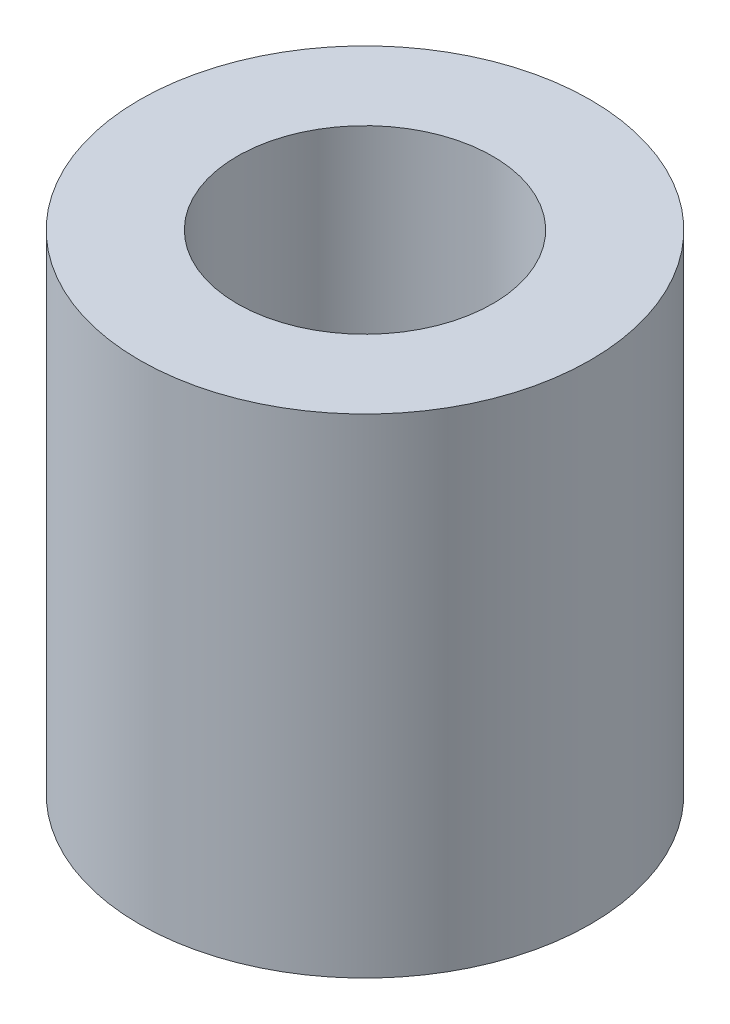
ISO-10303-21;
HEADER;
FILE_DESCRIPTION(('STEP AP214'),'2;1');
FILE_NAME('part.step','',(''),(''),'','','');
FILE_SCHEMA(('AUTOMOTIVE_DESIGN { 1 0 10303 214 1 1 1 1 }'));
ENDSEC;
DATA;
#1=APPLICATION_CONTEXT('core data for automotive mechanical design processes');
#2=APPLICATION_PROTOCOL_DEFINITION('international standard','automotive_design',2000,#1);
#3=PRODUCT_CONTEXT('',#1,'mechanical');
#4=PRODUCT('Part','Part','',(#3));
#5=PRODUCT_RELATED_PRODUCT_CATEGORY('part','',(#4));
#6=PRODUCT_DEFINITION_FORMATION('','',#4);
#7=PRODUCT_DEFINITION_CONTEXT('part definition',#1,'design');
#8=PRODUCT_DEFINITION('design','',#6,#7);
#9=PRODUCT_DEFINITION_SHAPE('','',#8);
#10=(LENGTH_UNIT() NAMED_UNIT(*) SI_UNIT(.MILLI.,.METRE.));
#11=(NAMED_UNIT(*) PLANE_ANGLE_UNIT() SI_UNIT($,.RADIAN.));
#12=(NAMED_UNIT(*) SI_UNIT($,.STERADIAN.) SOLID_ANGLE_UNIT());
#13=UNCERTAINTY_MEASURE_WITH_UNIT(LENGTH_MEASURE(1.E-05),#10,'distance_accuracy_value','');
#14=(GEOMETRIC_REPRESENTATION_CONTEXT(3) GLOBAL_UNCERTAINTY_ASSIGNED_CONTEXT((#13)) GLOBAL_UNIT_ASSIGNED_CONTEXT((#10,
#11,#12)) REPRESENTATION_CONTEXT('',''));
#15=CARTESIAN_POINT('',(0.,0.,0.));
#16=DIRECTION('',(0.,0.,1.));
#17=DIRECTION('',(1.,0.,0.));
#18=AXIS2_PLACEMENT_3D('',#15,#16,#17);
#19=CARTESIAN_POINT('',(0.,3.25,0.));
#20=DIRECTION('',(0.,-1.,0.));
#21=DIRECTION('',(0.,0.,-1.));
#22=AXIS2_PLACEMENT_3D('',#19,#20,#21);
#23=CYLINDRICAL_SURFACE('',#22,3.);
#24=CARTESIAN_POINT('',(0.,3.25,0.));
#25=DIRECTION('',(0.,1.,0.));
#26=DIRECTION('',(0.,0.,1.));
#27=AXIS2_PLACEMENT_3D('',#24,#25,#26);
#28=CIRCLE('',#27,3.);
#29=CARTESIAN_POINT('',(0.,3.25,-3.));
#30=VERTEX_POINT('',#29);
#31=EDGE_CURVE('E10',#30,#30,#28,.T.);
#32=CARTESIAN_POINT('',(0.,-3.25,0.));
#33=DIRECTION('',(0.,1.,0.));
#34=DIRECTION('',(0.,0.,1.));
#35=AXIS2_PLACEMENT_3D('',#32,#33,#34);
#36=CIRCLE('',#35,3.);
#37=CARTESIAN_POINT('',(0.,-3.25,-3.));
#38=VERTEX_POINT('',#37);
#39=EDGE_CURVE('E36',#38,#38,#36,.T.);
#40=CARTESIAN_POINT('',(0.,3.25,-3.));
#41=CARTESIAN_POINT('',(0.,3.18229166666667,-3.));
#42=CARTESIAN_POINT('',(0.,3.11458333333333,-3.));
#43=CARTESIAN_POINT('',(0.,2.97916666666667,-3.));
#44=CARTESIAN_POINT('',(0.,2.91145833333333,-3.));
#45=CARTESIAN_POINT('',(0.,2.77604166666667,-3.));
#46=CARTESIAN_POINT('',(0.,2.70833333333333,-3.));
#47=CARTESIAN_POINT('',(0.,2.57291666666667,-3.));
#48=CARTESIAN_POINT('',(0.,2.50520833333333,-3.));
#49=CARTESIAN_POINT('',(0.,2.36979166666667,-3.));
#50=CARTESIAN_POINT('',(0.,2.30208333333333,-3.));
#51=CARTESIAN_POINT('',(0.,2.16666666666667,-3.));
#52=CARTESIAN_POINT('',(0.,2.09895833333333,-3.));
#53=CARTESIAN_POINT('',(0.,1.96354166666667,-3.));
#54=CARTESIAN_POINT('',(0.,1.89583333333333,-3.));
#55=CARTESIAN_POINT('',(0.,1.76041666666667,-3.));
#56=CARTESIAN_POINT('',(0.,1.69270833333333,-3.));
#57=CARTESIAN_POINT('',(0.,1.55729166666667,-3.));
#58=CARTESIAN_POINT('',(0.,1.48958333333333,-3.));
#59=CARTESIAN_POINT('',(0.,1.35416666666667,-3.));
#60=CARTESIAN_POINT('',(0.,1.28645833333333,-3.));
#61=CARTESIAN_POINT('',(0.,1.15104166666667,-3.));
#62=CARTESIAN_POINT('',(0.,1.08333333333333,-3.));
#63=CARTESIAN_POINT('',(0.,0.947916666666666,-3.));
#64=CARTESIAN_POINT('',(0.,0.880208333333333,-3.));
#65=CARTESIAN_POINT('',(0.,0.744791666666666,-3.));
#66=CARTESIAN_POINT('',(0.,0.677083333333333,-3.));
#67=CARTESIAN_POINT('',(0.,0.541666666666666,-3.));
#68=CARTESIAN_POINT('',(0.,0.473958333333333,-3.));
#69=CARTESIAN_POINT('',(0.,0.338541666666666,-3.));
#70=CARTESIAN_POINT('',(0.,0.270833333333333,-3.));
#71=CARTESIAN_POINT('',(0.,0.135416666666666,-3.));
#72=CARTESIAN_POINT('',(0.,0.0677083333333329,-3.));
#73=CARTESIAN_POINT('',(0.,-0.0677083333333338,-3.));
#74=CARTESIAN_POINT('',(0.,-0.135416666666667,-3.));
#75=CARTESIAN_POINT('',(0.,-0.270833333333334,-3.));
#76=CARTESIAN_POINT('',(0.,-0.338541666666667,-3.));
#77=CARTESIAN_POINT('',(0.,-0.473958333333334,-3.));
#78=CARTESIAN_POINT('',(0.,-0.541666666666667,-3.));
#79=CARTESIAN_POINT('',(0.,-0.677083333333333,-3.));
#80=CARTESIAN_POINT('',(0.,-0.744791666666667,-3.));
#81=CARTESIAN_POINT('',(0.,-0.880208333333333,-3.));
#82=CARTESIAN_POINT('',(0.,-0.947916666666666,-3.));
#83=CARTESIAN_POINT('',(0.,-1.08333333333333,-3.));
#84=CARTESIAN_POINT('',(0.,-1.15104166666667,-3.));
#85=CARTESIAN_POINT('',(0.,-1.28645833333333,-3.));
#86=CARTESIAN_POINT('',(0.,-1.35416666666667,-3.));
#87=CARTESIAN_POINT('',(0.,-1.48958333333333,-3.));
#88=CARTESIAN_POINT('',(0.,-1.55729166666667,-3.));
#89=CARTESIAN_POINT('',(0.,-1.69270833333333,-3.));
#90=CARTESIAN_POINT('',(0.,-1.76041666666667,-3.));
#91=CARTESIAN_POINT('',(0.,-1.89583333333333,-3.));
#92=CARTESIAN_POINT('',(0.,-1.96354166666667,-3.));
#93=CARTESIAN_POINT('',(0.,-2.09895833333333,-3.));
#94=CARTESIAN_POINT('',(0.,-2.16666666666667,-3.));
#95=CARTESIAN_POINT('',(0.,-2.30208333333333,-3.));
#96=CARTESIAN_POINT('',(0.,-2.36979166666667,-3.));
#97=CARTESIAN_POINT('',(0.,-2.50520833333333,-3.));
#98=CARTESIAN_POINT('',(0.,-2.57291666666667,-3.));
#99=CARTESIAN_POINT('',(0.,-2.70833333333333,-3.));
#100=CARTESIAN_POINT('',(0.,-2.77604166666667,-3.));
#101=CARTESIAN_POINT('',(0.,-2.91145833333333,-3.));
#102=CARTESIAN_POINT('',(0.,-2.97916666666667,-3.));
#103=CARTESIAN_POINT('',(0.,-3.11458333333333,-3.));
#104=CARTESIAN_POINT('',(0.,-3.18229166666667,-3.));
#105=CARTESIAN_POINT('',(0.,-3.25,-3.));
#106=B_SPLINE_CURVE_WITH_KNOTS('',3,(#40,#41,#42,#43,#44,#45,#46,#47,#48,#49,#50,#51,#52,#53,
#54,#55,#56,#57,#58,#59,#60,#61,#62,#63,#64,#65,#66,#67,#68,#69,#70,#71,#72,#73,#74,#75,#76,#77,
#78,#79,#80,#81,#82,#83,#84,#85,#86,#87,#88,#89,#90,#91,#92,#93,#94,#95,#96,#97,#98,#99,#100,
#101,#102,#103,#104,#105),.UNSPECIFIED.,.F.,.F.,(4,2,2,2,2,2,2,2,2,2,2,2,2,2,2,2,2,2,2,2,2,2,2,
2,2,2,2,2,2,2,2,2,4),(0.,0.203125,0.40625,0.609375,0.8125,1.015625,1.21875,1.421875,1.625,
1.828125,2.03125,2.234375,2.4375,2.640625,2.84375,3.046875,3.25,3.453125,3.65625,3.859375,
4.0625,4.265625,4.46875,4.671875,4.875,5.078125,5.28125,5.484375,5.6875,5.890625,6.09375,
6.296875,6.5),.UNSPECIFIED.);
#107=EDGE_CURVE('BSEAM33',#30,#38,#106,.T.);
#108=ORIENTED_EDGE('',*,*,#31,.F.);
#109=ORIENTED_EDGE('',*,*,#39,.T.);
#110=ORIENTED_EDGE('',*,*,#107,.T.);
#111=ORIENTED_EDGE('',*,*,#107,.F.);
#112=EDGE_LOOP('',(#108,#110,#109,#111));
#113=FACE_BOUND('',#112,.T.);
#114=ADVANCED_FACE('F33',(#113),#23,.T.);
#115=CARTESIAN_POINT('',(0.,3.25,0.));
#116=DIRECTION('',(0.,1.,0.));
#117=DIRECTION('',(0.,0.,1.));
#118=AXIS2_PLACEMENT_3D('',#115,#116,#117);
#119=PLANE('',#118);
#120=CARTESIAN_POINT('',(0.,3.25,0.));
#121=DIRECTION('',(0.,1.,0.));
#122=DIRECTION('',(0.,0.,1.));
#123=AXIS2_PLACEMENT_3D('',#120,#121,#122);
#124=CIRCLE('',#123,1.69999999999999);
#125=CARTESIAN_POINT('',(0.,3.25,1.69999999999999));
#126=VERTEX_POINT('',#125);
#127=EDGE_CURVE('E47',#126,#126,#124,.T.);
#128=ORIENTED_EDGE('',*,*,#127,.F.);
#129=EDGE_LOOP('',(#128));
#130=FACE_BOUND('',#129,.T.);
#131=ORIENTED_EDGE('',*,*,#31,.T.);
#132=EDGE_LOOP('',(#131));
#133=FACE_BOUND('',#132,.T.);
#134=ADVANCED_FACE('F53',(#130,#133),#119,.T.);
#135=CARTESIAN_POINT('',(0.,-3.25,0.));
#136=DIRECTION('',(0.,1.,0.));
#137=DIRECTION('',(0.,0.,1.));
#138=AXIS2_PLACEMENT_3D('',#135,#136,#137);
#139=PLANE('',#138);
#140=CARTESIAN_POINT('',(0.,-3.25,0.));
#141=DIRECTION('',(0.,1.,0.));
#142=DIRECTION('',(0.,0.,1.));
#143=AXIS2_PLACEMENT_3D('',#140,#141,#142);
#144=CIRCLE('',#143,1.7);
#145=CARTESIAN_POINT('',(0.,-3.25,1.7));
#146=VERTEX_POINT('',#145);
#147=EDGE_CURVE('E43',#146,#146,#144,.T.);
#148=ORIENTED_EDGE('',*,*,#147,.T.);
#149=EDGE_LOOP('',(#148));
#150=FACE_BOUND('',#149,.T.);
#151=ORIENTED_EDGE('',*,*,#39,.F.);
#152=EDGE_LOOP('',(#151));
#153=FACE_BOUND('',#152,.T.);
#154=ADVANCED_FACE('F55',(#150,#153),#139,.F.);
#155=CARTESIAN_POINT('',(0.,3.25,0.));
#156=DIRECTION('',(0.,1.,0.));
#157=DIRECTION('',(0.,0.,1.));
#158=AXIS2_PLACEMENT_3D('',#155,#156,#157);
#159=CYLINDRICAL_SURFACE('',#158,1.69999999999999);
#160=ORIENTED_EDGE('',*,*,#147,.F.);
#161=EDGE_LOOP('',(#160));
#162=FACE_BOUND('',#161,.T.);
#163=ORIENTED_EDGE('',*,*,#127,.T.);
#164=EDGE_LOOP('',(#163));
#165=FACE_BOUND('',#164,.T.);
#166=ADVANCED_FACE('F51',(#162,#165),#159,.F.);
#167=CLOSED_SHELL('',(#114,#134,#154,#166));
#168=MANIFOLD_SOLID_BREP('B2',#167);
#169=ADVANCED_BREP_SHAPE_REPRESENTATION('',(#18,#168),#14);
#170=SHAPE_DEFINITION_REPRESENTATION(#9,#169);
ENDSEC;
END-ISO-10303-21;
